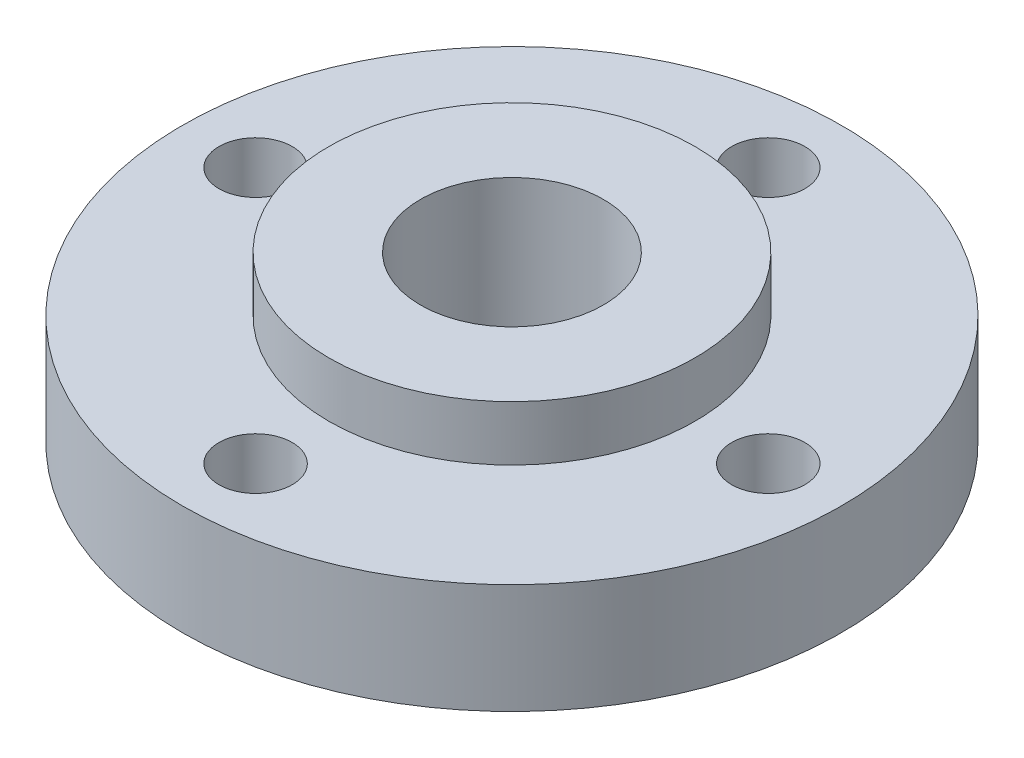
ISO-10303-21;
HEADER;
FILE_DESCRIPTION(('STEP AP214'),'2;1');
FILE_NAME('part.step','',(''),(''),'','','');
FILE_SCHEMA(('AUTOMOTIVE_DESIGN { 1 0 10303 214 1 1 1 1 }'));
ENDSEC;
DATA;
#1=APPLICATION_CONTEXT('core data for automotive mechanical design processes');
#2=APPLICATION_PROTOCOL_DEFINITION('international standard','automotive_design',2000,#1);
#3=PRODUCT_CONTEXT('',#1,'mechanical');
#4=PRODUCT('Part','Part','',(#3));
#5=PRODUCT_RELATED_PRODUCT_CATEGORY('part','',(#4));
#6=PRODUCT_DEFINITION_FORMATION('','',#4);
#7=PRODUCT_DEFINITION_CONTEXT('part definition',#1,'design');
#8=PRODUCT_DEFINITION('design','',#6,#7);
#9=PRODUCT_DEFINITION_SHAPE('','',#8);
#10=(LENGTH_UNIT() NAMED_UNIT(*) SI_UNIT(.MILLI.,.METRE.));
#11=(NAMED_UNIT(*) PLANE_ANGLE_UNIT() SI_UNIT($,.RADIAN.));
#12=(NAMED_UNIT(*) SI_UNIT($,.STERADIAN.) SOLID_ANGLE_UNIT());
#13=UNCERTAINTY_MEASURE_WITH_UNIT(LENGTH_MEASURE(1.E-05),#10,'distance_accuracy_value','');
#14=(GEOMETRIC_REPRESENTATION_CONTEXT(3) GLOBAL_UNCERTAINTY_ASSIGNED_CONTEXT((#13)) GLOBAL_UNIT_ASSIGNED_CONTEXT((#10,
#11,#12)) REPRESENTATION_CONTEXT('',''));
#15=CARTESIAN_POINT('',(0.,0.,0.));
#16=DIRECTION('',(0.,0.,1.));
#17=DIRECTION('',(1.,0.,0.));
#18=AXIS2_PLACEMENT_3D('',#15,#16,#17);
#19=CARTESIAN_POINT('',(0.,12.,0.));
#20=DIRECTION('',(0.,1.,0.));
#21=DIRECTION('',(0.,0.,1.));
#22=AXIS2_PLACEMENT_3D('',#19,#20,#21);
#23=PLANE('',#22);
#24=CARTESIAN_POINT('',(0.,12.,28.));
#25=DIRECTION('',(0.,1.,0.));
#26=DIRECTION('',(0.,0.,1.));
#27=AXIS2_PLACEMENT_3D('',#24,#25,#26);
#28=CIRCLE('',#27,4.);
#29=CARTESIAN_POINT('',(0.,12.,32.));
#30=VERTEX_POINT('',#29);
#31=EDGE_CURVE('E95',#30,#30,#28,.T.);
#32=ORIENTED_EDGE('',*,*,#31,.F.);
#33=EDGE_LOOP('',(#32));
#34=FACE_BOUND('',#33,.T.);
#35=CARTESIAN_POINT('',(-28.,12.,0.));
#36=DIRECTION('',(0.,1.,0.));
#37=DIRECTION('',(0.,0.,1.));
#38=AXIS2_PLACEMENT_3D('',#35,#36,#37);
#39=CIRCLE('',#38,4.);
#40=CARTESIAN_POINT('',(-28.,12.,3.9999999999999));
#41=VERTEX_POINT('',#40);
#42=EDGE_CURVE('E91',#41,#41,#39,.T.);
#43=ORIENTED_EDGE('',*,*,#42,.F.);
#44=EDGE_LOOP('',(#43));
#45=FACE_BOUND('',#44,.T.);
#46=CARTESIAN_POINT('',(1.95522954975215E-13,12.,-28.));
#47=DIRECTION('',(0.,1.,0.));
#48=DIRECTION('',(0.,0.,1.));
#49=AXIS2_PLACEMENT_3D('',#46,#47,#48);
#50=CIRCLE('',#49,4.);
#51=CARTESIAN_POINT('',(1.95522954975215E-13,12.,-24.));
#52=VERTEX_POINT('',#51);
#53=EDGE_CURVE('E83',#52,#52,#50,.T.);
#54=ORIENTED_EDGE('',*,*,#53,.F.);
#55=EDGE_LOOP('',(#54));
#56=FACE_BOUND('',#55,.T.);
#57=CARTESIAN_POINT('',(28.,12.,2.93284432462823E-13));
#58=DIRECTION('',(0.,1.,0.));
#59=DIRECTION('',(0.,0.,1.));
#60=AXIS2_PLACEMENT_3D('',#57,#58,#59);
#61=CIRCLE('',#60,4.);
#62=CARTESIAN_POINT('',(28.,12.,4.00000000000029));
#63=VERTEX_POINT('',#62);
#64=EDGE_CURVE('E74',#63,#63,#61,.T.);
#65=ORIENTED_EDGE('',*,*,#64,.F.);
#66=EDGE_LOOP('',(#65));
#67=FACE_BOUND('',#66,.T.);
#68=CARTESIAN_POINT('',(0.,12.,0.));
#69=DIRECTION('',(0.,1.,0.));
#70=DIRECTION('',(0.,0.,1.));
#71=AXIS2_PLACEMENT_3D('',#68,#69,#70);
#72=CIRCLE('',#71,36.);
#73=CARTESIAN_POINT('',(0.,12.,36.));
#74=VERTEX_POINT('',#73);
#75=EDGE_CURVE('E10',#74,#74,#72,.T.);
#76=ORIENTED_EDGE('',*,*,#75,.T.);
#77=EDGE_LOOP('',(#76));
#78=FACE_BOUND('',#77,.T.);
#79=CARTESIAN_POINT('',(0.,12.,0.));
#80=DIRECTION('',(0.,1.,0.));
#81=DIRECTION('',(0.,0.,1.));
#82=AXIS2_PLACEMENT_3D('',#79,#80,#81);
#83=CIRCLE('',#82,20.);
#84=CARTESIAN_POINT('',(0.,12.,20.));
#85=VERTEX_POINT('',#84);
#86=EDGE_CURVE('E62',#85,#85,#83,.T.);
#87=ORIENTED_EDGE('',*,*,#86,.F.);
#88=EDGE_LOOP('',(#87));
#89=FACE_BOUND('',#88,.T.);
#90=ADVANCED_FACE('F43',(#34,#45,#56,#67,#78,#89),#23,.T.);
#91=CARTESIAN_POINT('',(0.,0.,0.));
#92=DIRECTION('',(0.,1.,0.));
#93=DIRECTION('',(0.,0.,1.));
#94=AXIS2_PLACEMENT_3D('',#91,#92,#93);
#95=PLANE('',#94);
#96=CARTESIAN_POINT('',(0.,0.,28.));
#97=DIRECTION('',(0.,1.,0.));
#98=DIRECTION('',(0.,0.,1.));
#99=AXIS2_PLACEMENT_3D('',#96,#97,#98);
#100=CIRCLE('',#99,4.);
#101=CARTESIAN_POINT('',(0.,0.,32.));
#102=VERTEX_POINT('',#101);
#103=EDGE_CURVE('E73',#102,#102,#100,.F.);
#104=ORIENTED_EDGE('',*,*,#103,.F.);
#105=EDGE_LOOP('',(#104));
#106=FACE_BOUND('',#105,.T.);
#107=CARTESIAN_POINT('',(-28.,0.,0.));
#108=DIRECTION('',(0.,1.,0.));
#109=DIRECTION('',(0.,0.,1.));
#110=AXIS2_PLACEMENT_3D('',#107,#108,#109);
#111=CIRCLE('',#110,4.);
#112=CARTESIAN_POINT('',(-28.,0.,3.9999999999999));
#113=VERTEX_POINT('',#112);
#114=EDGE_CURVE('E87',#113,#113,#111,.F.);
#115=ORIENTED_EDGE('',*,*,#114,.F.);
#116=EDGE_LOOP('',(#115));
#117=FACE_BOUND('',#116,.T.);
#118=CARTESIAN_POINT('',(1.95522954975215E-13,0.,-28.));
#119=DIRECTION('',(0.,1.,0.));
#120=DIRECTION('',(0.,0.,1.));
#121=AXIS2_PLACEMENT_3D('',#118,#119,#120);
#122=CIRCLE('',#121,4.);
#123=CARTESIAN_POINT('',(1.95522954975215E-13,0.,-24.));
#124=VERTEX_POINT('',#123);
#125=EDGE_CURVE('E78',#124,#124,#122,.F.);
#126=ORIENTED_EDGE('',*,*,#125,.F.);
#127=EDGE_LOOP('',(#126));
#128=FACE_BOUND('',#127,.T.);
#129=CARTESIAN_POINT('',(28.,0.,2.93284432462823E-13));
#130=DIRECTION('',(0.,1.,0.));
#131=DIRECTION('',(0.,0.,1.));
#132=AXIS2_PLACEMENT_3D('',#129,#130,#131);
#133=CIRCLE('',#132,4.);
#134=CARTESIAN_POINT('',(28.,0.,4.00000000000029));
#135=VERTEX_POINT('',#134);
#136=EDGE_CURVE('E79',#135,#135,#133,.F.);
#137=ORIENTED_EDGE('',*,*,#136,.F.);
#138=EDGE_LOOP('',(#137));
#139=FACE_BOUND('',#138,.T.);
#140=CARTESIAN_POINT('',(0.,0.,0.));
#141=DIRECTION('',(0.,1.,0.));
#142=DIRECTION('',(0.,0.,1.));
#143=AXIS2_PLACEMENT_3D('',#140,#141,#142);
#144=CIRCLE('',#143,36.);
#145=CARTESIAN_POINT('',(0.,0.,36.));
#146=VERTEX_POINT('',#145);
#147=EDGE_CURVE('E47',#146,#146,#144,.T.);
#148=ORIENTED_EDGE('',*,*,#147,.F.);
#149=EDGE_LOOP('',(#148));
#150=FACE_BOUND('',#149,.T.);
#151=CARTESIAN_POINT('',(0.,0.,0.));
#152=DIRECTION('',(0.,1.,0.));
#153=DIRECTION('',(0.,0.,1.));
#154=AXIS2_PLACEMENT_3D('',#151,#152,#153);
#155=CIRCLE('',#154,10.);
#156=CARTESIAN_POINT('',(0.,0.,10.));
#157=VERTEX_POINT('',#156);
#158=EDGE_CURVE('E56',#157,#157,#155,.T.);
#159=ORIENTED_EDGE('',*,*,#158,.T.);
#160=EDGE_LOOP('',(#159));
#161=FACE_BOUND('',#160,.T.);
#162=ADVANCED_FACE('F111',(#106,#117,#128,#139,#150,#161),#95,.F.);
#163=CARTESIAN_POINT('',(0.,12.,0.));
#164=DIRECTION('',(0.,-1.,0.));
#165=DIRECTION('',(0.,0.,-1.));
#166=AXIS2_PLACEMENT_3D('',#163,#164,#165);
#167=CYLINDRICAL_SURFACE('',#166,36.);
#168=ORIENTED_EDGE('',*,*,#75,.F.);
#169=EDGE_LOOP('',(#168));
#170=FACE_BOUND('',#169,.T.);
#171=ORIENTED_EDGE('',*,*,#147,.T.);
#172=EDGE_LOOP('',(#171));
#173=FACE_BOUND('',#172,.T.);
#174=ADVANCED_FACE('F45',(#170,#173),#167,.T.);
#175=CARTESIAN_POINT('',(0.,12.,0.));
#176=DIRECTION('',(0.,-1.,0.));
#177=DIRECTION('',(0.,0.,-1.));
#178=AXIS2_PLACEMENT_3D('',#175,#176,#177);
#179=CYLINDRICAL_SURFACE('',#178,10.);
#180=ORIENTED_EDGE('',*,*,#158,.F.);
#181=EDGE_LOOP('',(#180));
#182=FACE_BOUND('',#181,.T.);
#183=CARTESIAN_POINT('',(0.,18.,0.));
#184=DIRECTION('',(0.,1.,0.));
#185=DIRECTION('',(0.,0.,1.));
#186=AXIS2_PLACEMENT_3D('',#183,#184,#185);
#187=CIRCLE('',#186,10.);
#188=CARTESIAN_POINT('',(0.,18.,10.));
#189=VERTEX_POINT('',#188);
#190=EDGE_CURVE('E66',#189,#189,#187,.T.);
#191=ORIENTED_EDGE('',*,*,#190,.T.);
#192=EDGE_LOOP('',(#191));
#193=FACE_BOUND('',#192,.T.);
#194=ADVANCED_FACE('F134',(#182,#193),#179,.F.);
#195=CARTESIAN_POINT('',(0.,18.,0.));
#196=DIRECTION('',(0.,1.,0.));
#197=DIRECTION('',(0.,0.,1.));
#198=AXIS2_PLACEMENT_3D('',#195,#196,#197);
#199=PLANE('',#198);
#200=CARTESIAN_POINT('',(0.,18.,0.));
#201=DIRECTION('',(0.,1.,0.));
#202=DIRECTION('',(0.,0.,1.));
#203=AXIS2_PLACEMENT_3D('',#200,#201,#202);
#204=CIRCLE('',#203,20.);
#205=CARTESIAN_POINT('',(0.,18.,20.));
#206=VERTEX_POINT('',#205);
#207=EDGE_CURVE('E61',#206,#206,#204,.T.);
#208=ORIENTED_EDGE('',*,*,#207,.T.);
#209=EDGE_LOOP('',(#208));
#210=FACE_BOUND('',#209,.T.);
#211=ORIENTED_EDGE('',*,*,#190,.F.);
#212=EDGE_LOOP('',(#211));
#213=FACE_BOUND('',#212,.T.);
#214=ADVANCED_FACE('F124',(#210,#213),#199,.T.);
#215=CARTESIAN_POINT('',(0.,18.,0.));
#216=DIRECTION('',(0.,-1.,0.));
#217=DIRECTION('',(0.,0.,-1.));
#218=AXIS2_PLACEMENT_3D('',#215,#216,#217);
#219=CYLINDRICAL_SURFACE('',#218,20.);
#220=ORIENTED_EDGE('',*,*,#207,.F.);
#221=EDGE_LOOP('',(#220));
#222=FACE_BOUND('',#221,.T.);
#223=ORIENTED_EDGE('',*,*,#86,.T.);
#224=EDGE_LOOP('',(#223));
#225=FACE_BOUND('',#224,.T.);
#226=ADVANCED_FACE('F121',(#222,#225),#219,.T.);
#227=CARTESIAN_POINT('',(28.,-0.000999999999999265,2.93284432462823E-13));
#228=DIRECTION('',(0.,1.,0.));
#229=DIRECTION('',(0.,0.,1.));
#230=AXIS2_PLACEMENT_3D('',#227,#228,#229);
#231=CYLINDRICAL_SURFACE('',#230,4.);
#232=ORIENTED_EDGE('',*,*,#64,.T.);
#233=EDGE_LOOP('',(#232));
#234=FACE_BOUND('',#233,.T.);
#235=ORIENTED_EDGE('',*,*,#136,.T.);
#236=EDGE_LOOP('',(#235));
#237=FACE_BOUND('',#236,.T.);
#238=ADVANCED_FACE('F123',(#234,#237),#231,.F.);
#239=CARTESIAN_POINT('',(1.95522954975215E-13,-0.000999999999999265,-28.));
#240=DIRECTION('',(0.,1.,0.));
#241=DIRECTION('',(0.,0.,1.));
#242=AXIS2_PLACEMENT_3D('',#239,#240,#241);
#243=CYLINDRICAL_SURFACE('',#242,4.);
#244=ORIENTED_EDGE('',*,*,#53,.T.);
#245=EDGE_LOOP('',(#244));
#246=FACE_BOUND('',#245,.T.);
#247=ORIENTED_EDGE('',*,*,#125,.T.);
#248=EDGE_LOOP('',(#247));
#249=FACE_BOUND('',#248,.T.);
#250=ADVANCED_FACE('F131',(#246,#249),#243,.F.);
#251=CARTESIAN_POINT('',(-28.,-0.000999999999999265,0.));
#252=DIRECTION('',(0.,1.,0.));
#253=DIRECTION('',(0.,0.,1.));
#254=AXIS2_PLACEMENT_3D('',#251,#252,#253);
#255=CYLINDRICAL_SURFACE('',#254,4.);
#256=ORIENTED_EDGE('',*,*,#42,.T.);
#257=EDGE_LOOP('',(#256));
#258=FACE_BOUND('',#257,.T.);
#259=ORIENTED_EDGE('',*,*,#114,.T.);
#260=EDGE_LOOP('',(#259));
#261=FACE_BOUND('',#260,.T.);
#262=ADVANCED_FACE('F165',(#258,#261),#255,.F.);
#263=CARTESIAN_POINT('',(0.,-0.000999999999999265,28.));
#264=DIRECTION('',(0.,1.,0.));
#265=DIRECTION('',(0.,0.,1.));
#266=AXIS2_PLACEMENT_3D('',#263,#264,#265);
#267=CYLINDRICAL_SURFACE('',#266,4.);
#268=ORIENTED_EDGE('',*,*,#31,.T.);
#269=EDGE_LOOP('',(#268));
#270=FACE_BOUND('',#269,.T.);
#271=ORIENTED_EDGE('',*,*,#103,.T.);
#272=EDGE_LOOP('',(#271));
#273=FACE_BOUND('',#272,.T.);
#274=ADVANCED_FACE('F106',(#270,#273),#267,.F.);
#275=CLOSED_SHELL('',(#90,#162,#174,#194,#214,#226,#238,#250,#262,#274));
#276=MANIFOLD_SOLID_BREP('B2',#275);
#277=ADVANCED_BREP_SHAPE_REPRESENTATION('',(#18,#276),#14);
#278=SHAPE_DEFINITION_REPRESENTATION(#9,#277);
ENDSEC;
END-ISO-10303-21;
